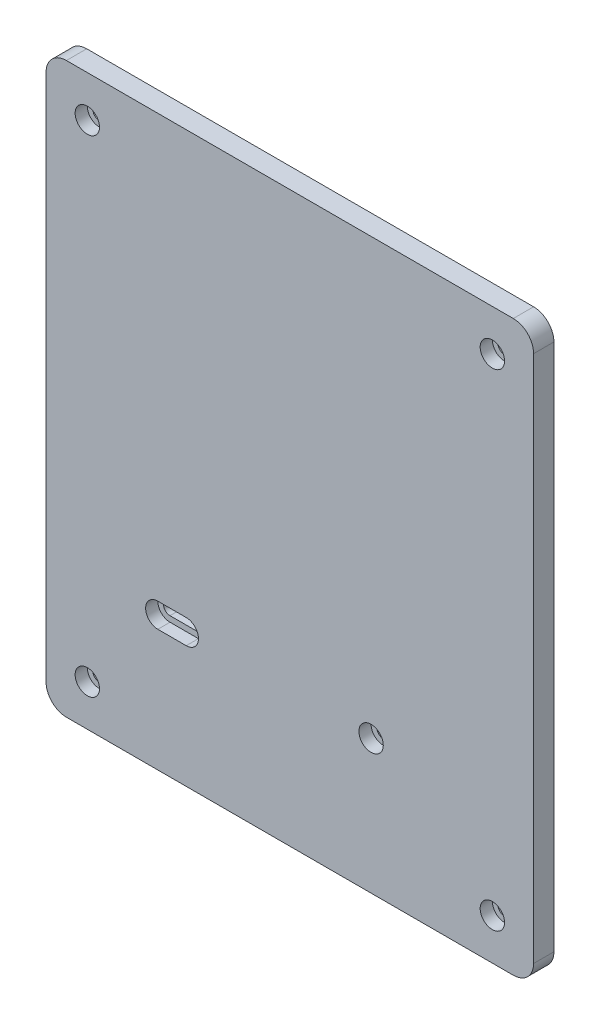
ISO-10303-21;
HEADER;
FILE_DESCRIPTION(('STEP AP214'),'2;1');
FILE_NAME('part.step','',(''),(''),'','','');
FILE_SCHEMA(('AUTOMOTIVE_DESIGN { 1 0 10303 214 1 1 1 1 }'));
ENDSEC;
DATA;
#1=APPLICATION_CONTEXT('core data for automotive mechanical design processes');
#2=APPLICATION_PROTOCOL_DEFINITION('international standard','automotive_design',2000,#1);
#3=PRODUCT_CONTEXT('',#1,'mechanical');
#4=PRODUCT('Part','Part','',(#3));
#5=PRODUCT_RELATED_PRODUCT_CATEGORY('part','',(#4));
#6=PRODUCT_DEFINITION_FORMATION('','',#4);
#7=PRODUCT_DEFINITION_CONTEXT('part definition',#1,'design');
#8=PRODUCT_DEFINITION('design','',#6,#7);
#9=PRODUCT_DEFINITION_SHAPE('','',#8);
#10=(LENGTH_UNIT() NAMED_UNIT(*) SI_UNIT(.MILLI.,.METRE.));
#11=(NAMED_UNIT(*) PLANE_ANGLE_UNIT() SI_UNIT($,.RADIAN.));
#12=(NAMED_UNIT(*) SI_UNIT($,.STERADIAN.) SOLID_ANGLE_UNIT());
#13=UNCERTAINTY_MEASURE_WITH_UNIT(LENGTH_MEASURE(1.E-05),#10,'distance_accuracy_value','');
#14=(GEOMETRIC_REPRESENTATION_CONTEXT(3) GLOBAL_UNCERTAINTY_ASSIGNED_CONTEXT((#13)) GLOBAL_UNIT_ASSIGNED_CONTEXT((#10,
#11,#12)) REPRESENTATION_CONTEXT('',''));
#15=CARTESIAN_POINT('',(0.,0.,0.));
#16=DIRECTION('',(0.,0.,1.));
#17=DIRECTION('',(1.,0.,0.));
#18=AXIS2_PLACEMENT_3D('',#15,#16,#17);
#19=CARTESIAN_POINT('',(-49.85,-59.85,5.));
#20=DIRECTION('',(0.,0.,-1.));
#21=DIRECTION('',(-1.,0.,0.));
#22=AXIS2_PLACEMENT_3D('',#19,#20,#21);
#23=CYLINDRICAL_SURFACE('',#22,1.65);
#24=CARTESIAN_POINT('',(-49.85,-59.85,0.));
#25=DIRECTION('',(0.,0.,1.));
#26=DIRECTION('',(1.,0.,0.));
#27=AXIS2_PLACEMENT_3D('',#24,#25,#26);
#28=CIRCLE('',#27,1.65);
#29=CARTESIAN_POINT('',(-48.2,-59.85,0.));
#30=VERTEX_POINT('',#29);
#31=EDGE_CURVE('E197',#30,#30,#28,.T.);
#32=ORIENTED_EDGE('',*,*,#31,.F.);
#33=EDGE_LOOP('',(#32));
#34=FACE_BOUND('',#33,.T.);
#35=CARTESIAN_POINT('',(-49.85,-59.85,2.));
#36=DIRECTION('',(0.,0.,1.));
#37=DIRECTION('',(1.,0.,0.));
#38=AXIS2_PLACEMENT_3D('',#35,#36,#37);
#39=CIRCLE('',#38,1.65);
#40=CARTESIAN_POINT('',(-48.2,-59.85,2.));
#41=VERTEX_POINT('',#40);
#42=EDGE_CURVE('E39',#41,#41,#39,.T.);
#43=ORIENTED_EDGE('',*,*,#42,.T.);
#44=EDGE_LOOP('',(#43));
#45=FACE_BOUND('',#44,.T.);
#46=ADVANCED_FACE('F35',(#34,#45),#23,.F.);
#47=CARTESIAN_POINT('',(49.85,-59.85,5.));
#48=DIRECTION('',(0.,0.,-1.));
#49=DIRECTION('',(-1.,0.,0.));
#50=AXIS2_PLACEMENT_3D('',#47,#48,#49);
#51=CYLINDRICAL_SURFACE('',#50,1.65);
#52=CARTESIAN_POINT('',(49.85,-59.85,0.));
#53=DIRECTION('',(0.,0.,1.));
#54=DIRECTION('',(1.,0.,0.));
#55=AXIS2_PLACEMENT_3D('',#52,#53,#54);
#56=CIRCLE('',#55,1.65);
#57=CARTESIAN_POINT('',(51.5,-59.85,0.));
#58=VERTEX_POINT('',#57);
#59=EDGE_CURVE('E194',#58,#58,#56,.T.);
#60=ORIENTED_EDGE('',*,*,#59,.F.);
#61=EDGE_LOOP('',(#60));
#62=FACE_BOUND('',#61,.T.);
#63=CARTESIAN_POINT('',(49.85,-59.85,2.));
#64=DIRECTION('',(0.,0.,1.));
#65=DIRECTION('',(1.,0.,0.));
#66=AXIS2_PLACEMENT_3D('',#63,#64,#65);
#67=CIRCLE('',#66,1.65);
#68=CARTESIAN_POINT('',(51.5,-59.85,2.));
#69=VERTEX_POINT('',#68);
#70=EDGE_CURVE('E262',#69,#69,#67,.T.);
#71=ORIENTED_EDGE('',*,*,#70,.T.);
#72=EDGE_LOOP('',(#71));
#73=FACE_BOUND('',#72,.T.);
#74=ADVANCED_FACE('F423',(#62,#73),#51,.F.);
#75=CARTESIAN_POINT('',(49.85,59.85,5.));
#76=DIRECTION('',(0.,0.,-1.));
#77=DIRECTION('',(-1.,0.,0.));
#78=AXIS2_PLACEMENT_3D('',#75,#76,#77);
#79=CYLINDRICAL_SURFACE('',#78,1.65);
#80=CARTESIAN_POINT('',(49.85,59.85,0.));
#81=DIRECTION('',(0.,0.,1.));
#82=DIRECTION('',(1.,0.,0.));
#83=AXIS2_PLACEMENT_3D('',#80,#81,#82);
#84=CIRCLE('',#83,1.65);
#85=CARTESIAN_POINT('',(51.5,59.85,0.));
#86=VERTEX_POINT('',#85);
#87=EDGE_CURVE('E191',#86,#86,#84,.T.);
#88=ORIENTED_EDGE('',*,*,#87,.F.);
#89=EDGE_LOOP('',(#88));
#90=FACE_BOUND('',#89,.T.);
#91=CARTESIAN_POINT('',(49.85,59.85,2.));
#92=DIRECTION('',(0.,0.,1.));
#93=DIRECTION('',(1.,0.,0.));
#94=AXIS2_PLACEMENT_3D('',#91,#92,#93);
#95=CIRCLE('',#94,1.65);
#96=CARTESIAN_POINT('',(51.5,59.85,2.));
#97=VERTEX_POINT('',#96);
#98=EDGE_CURVE('E259',#97,#97,#95,.T.);
#99=ORIENTED_EDGE('',*,*,#98,.T.);
#100=EDGE_LOOP('',(#99));
#101=FACE_BOUND('',#100,.T.);
#102=ADVANCED_FACE('F429',(#90,#101),#79,.F.);
#103=CARTESIAN_POINT('',(-49.85,59.85,5.));
#104=DIRECTION('',(0.,0.,-1.));
#105=DIRECTION('',(-1.,0.,0.));
#106=AXIS2_PLACEMENT_3D('',#103,#104,#105);
#107=CYLINDRICAL_SURFACE('',#106,1.65);
#108=CARTESIAN_POINT('',(-49.85,59.85,0.));
#109=DIRECTION('',(0.,0.,1.));
#110=DIRECTION('',(1.,0.,0.));
#111=AXIS2_PLACEMENT_3D('',#108,#109,#110);
#112=CIRCLE('',#111,1.65);
#113=CARTESIAN_POINT('',(-48.2,59.85,0.));
#114=VERTEX_POINT('',#113);
#115=EDGE_CURVE('E188',#114,#114,#112,.T.);
#116=ORIENTED_EDGE('',*,*,#115,.F.);
#117=EDGE_LOOP('',(#116));
#118=FACE_BOUND('',#117,.T.);
#119=CARTESIAN_POINT('',(-49.85,59.85,2.));
#120=DIRECTION('',(0.,0.,1.));
#121=DIRECTION('',(1.,0.,0.));
#122=AXIS2_PLACEMENT_3D('',#119,#120,#121);
#123=CIRCLE('',#122,1.65);
#124=CARTESIAN_POINT('',(-48.2,59.85,2.));
#125=VERTEX_POINT('',#124);
#126=EDGE_CURVE('E256',#125,#125,#123,.T.);
#127=ORIENTED_EDGE('',*,*,#126,.T.);
#128=EDGE_LOOP('',(#127));
#129=FACE_BOUND('',#128,.T.);
#130=ADVANCED_FACE('F488',(#118,#129),#107,.F.);
#131=CARTESIAN_POINT('',(0.,-38.6,-10.6901824119142));
#132=DIRECTION('',(0.,-1.,0.));
#133=DIRECTION('',(0.,0.,-1.));
#134=AXIS2_PLACEMENT_3D('',#131,#132,#133);
#135=PLANE('',#134);
#136=DIRECTION('',(1.,0.,0.));
#137=VECTOR('',#136,1.);
#138=CARTESIAN_POINT('',(-32.5,-38.6,2.));
#139=LINE('',#138,#137);
#140=CARTESIAN_POINT('',(-32.5,-38.6,2.));
#141=VERTEX_POINT('',#140);
#142=CARTESIAN_POINT('',(-25.5,-38.6,2.));
#143=VERTEX_POINT('',#142);
#144=EDGE_CURVE('E148',#141,#143,#139,.T.);
#145=ORIENTED_EDGE('',*,*,#144,.T.);
#146=DIRECTION('',(0.,0.,1.));
#147=VECTOR('',#146,1.);
#148=CARTESIAN_POINT('',(-25.5,-38.6,-10.6901824119142));
#149=LINE('',#148,#147);
#150=CARTESIAN_POINT('',(-25.5,-38.6,0.));
#151=VERTEX_POINT('',#150);
#152=EDGE_CURVE('E183',#151,#143,#149,.T.);
#153=ORIENTED_EDGE('',*,*,#152,.F.);
#154=DIRECTION('',(-1.,0.,0.));
#155=VECTOR('',#154,1.);
#156=CARTESIAN_POINT('',(0.,-38.6,0.));
#157=LINE('',#156,#155);
#158=CARTESIAN_POINT('',(-32.5,-38.6,0.));
#159=VERTEX_POINT('',#158);
#160=EDGE_CURVE('E170',#151,#159,#157,.T.);
#161=ORIENTED_EDGE('',*,*,#160,.T.);
#162=DIRECTION('',(0.,0.,1.));
#163=VECTOR('',#162,1.);
#164=CARTESIAN_POINT('',(-32.5,-38.6,-10.6901824119142));
#165=LINE('',#164,#163);
#166=EDGE_CURVE('E163',#159,#141,#165,.T.);
#167=ORIENTED_EDGE('',*,*,#166,.T.);
#168=EDGE_LOOP('',(#145,#153,#161,#167));
#169=FACE_BOUND('',#168,.T.);
#170=ADVANCED_FACE('F168',(#169),#135,.F.);
#171=CARTESIAN_POINT('',(-32.5,-37.,-10.6901824119142));
#172=DIRECTION('',(0.,0.,1.));
#173=DIRECTION('',(1.,0.,0.));
#174=AXIS2_PLACEMENT_3D('',#171,#172,#173);
#175=CYLINDRICAL_SURFACE('',#174,1.6);
#176=CARTESIAN_POINT('',(-32.5,-37.,2.));
#177=DIRECTION('',(0.,0.,1.));
#178=DIRECTION('',(1.,0.,0.));
#179=AXIS2_PLACEMENT_3D('',#176,#177,#178);
#180=CIRCLE('',#179,1.6);
#181=CARTESIAN_POINT('',(-32.5,-35.4,2.));
#182=VERTEX_POINT('',#181);
#183=EDGE_CURVE('E152',#182,#141,#180,.T.);
#184=ORIENTED_EDGE('',*,*,#183,.T.);
#185=ORIENTED_EDGE('',*,*,#166,.F.);
#186=CARTESIAN_POINT('',(-32.5,-37.,0.));
#187=DIRECTION('',(0.,0.,1.));
#188=DIRECTION('',(1.,0.,0.));
#189=AXIS2_PLACEMENT_3D('',#186,#187,#188);
#190=CIRCLE('',#189,1.6);
#191=CARTESIAN_POINT('',(-32.5,-35.4,0.));
#192=VERTEX_POINT('',#191);
#193=EDGE_CURVE('E174',#159,#192,#190,.F.);
#194=ORIENTED_EDGE('',*,*,#193,.T.);
#195=DIRECTION('',(0.,0.,1.));
#196=VECTOR('',#195,1.);
#197=CARTESIAN_POINT('',(-32.5,-35.4,-10.6901824119142));
#198=LINE('',#197,#196);
#199=EDGE_CURVE('E166',#192,#182,#198,.T.);
#200=ORIENTED_EDGE('',*,*,#199,.T.);
#201=EDGE_LOOP('',(#184,#185,#194,#200));
#202=FACE_BOUND('',#201,.T.);
#203=ADVANCED_FACE('F162',(#202),#175,.F.);
#204=CARTESIAN_POINT('',(0.,-35.4,-10.6901824119142));
#205=DIRECTION('',(0.,-1.,0.));
#206=DIRECTION('',(0.,0.,-1.));
#207=AXIS2_PLACEMENT_3D('',#204,#205,#206);
#208=PLANE('',#207);
#209=DIRECTION('',(0.,0.,1.));
#210=VECTOR('',#209,1.);
#211=CARTESIAN_POINT('',(-25.5,-35.4,-10.6901824119142));
#212=LINE('',#211,#210);
#213=CARTESIAN_POINT('',(-25.5,-35.4,0.));
#214=VERTEX_POINT('',#213);
#215=CARTESIAN_POINT('',(-25.5,-35.4,2.));
#216=VERTEX_POINT('',#215);
#217=EDGE_CURVE('E176',#214,#216,#212,.T.);
#218=ORIENTED_EDGE('',*,*,#217,.T.);
#219=DIRECTION('',(-1.,0.,0.));
#220=VECTOR('',#219,1.);
#221=CARTESIAN_POINT('',(-32.5,-35.4,2.));
#222=LINE('',#221,#220);
#223=EDGE_CURVE('E60',#216,#182,#222,.T.);
#224=ORIENTED_EDGE('',*,*,#223,.T.);
#225=ORIENTED_EDGE('',*,*,#199,.F.);
#226=DIRECTION('',(-1.,0.,0.));
#227=VECTOR('',#226,1.);
#228=CARTESIAN_POINT('',(0.,-35.4,0.));
#229=LINE('',#228,#227);
#230=EDGE_CURVE('E171',#214,#192,#229,.T.);
#231=ORIENTED_EDGE('',*,*,#230,.F.);
#232=EDGE_LOOP('',(#218,#224,#225,#231));
#233=FACE_BOUND('',#232,.T.);
#234=ADVANCED_FACE('F309',(#233),#208,.T.);
#235=CARTESIAN_POINT('',(-25.5,-37.,-10.6901824119142));
#236=DIRECTION('',(0.,0.,1.));
#237=DIRECTION('',(1.,0.,0.));
#238=AXIS2_PLACEMENT_3D('',#235,#236,#237);
#239=CYLINDRICAL_SURFACE('',#238,1.6);
#240=CARTESIAN_POINT('',(-25.5,-37.,2.));
#241=DIRECTION('',(0.,0.,1.));
#242=DIRECTION('',(1.,0.,0.));
#243=AXIS2_PLACEMENT_3D('',#240,#241,#242);
#244=CIRCLE('',#243,1.6);
#245=EDGE_CURVE('E153',#143,#216,#244,.T.);
#246=ORIENTED_EDGE('',*,*,#245,.T.);
#247=ORIENTED_EDGE('',*,*,#217,.F.);
#248=CARTESIAN_POINT('',(-25.5,-37.,0.));
#249=DIRECTION('',(0.,0.,1.));
#250=DIRECTION('',(1.,0.,0.));
#251=AXIS2_PLACEMENT_3D('',#248,#249,#250);
#252=CIRCLE('',#251,1.6);
#253=EDGE_CURVE('E185',#214,#151,#252,.F.);
#254=ORIENTED_EDGE('',*,*,#253,.T.);
#255=ORIENTED_EDGE('',*,*,#152,.T.);
#256=EDGE_LOOP('',(#246,#247,#254,#255));
#257=FACE_BOUND('',#256,.T.);
#258=ADVANCED_FACE('F314',(#257),#239,.F.);
#259=CARTESIAN_POINT('',(20.,-37.,-10.6901824119142));
#260=DIRECTION('',(0.,0.,1.));
#261=DIRECTION('',(1.,0.,0.));
#262=AXIS2_PLACEMENT_3D('',#259,#260,#261);
#263=CYLINDRICAL_SURFACE('',#262,1.6);
#264=CARTESIAN_POINT('',(20.,-37.,0.));
#265=DIRECTION('',(0.,0.,1.));
#266=DIRECTION('',(1.,0.,0.));
#267=AXIS2_PLACEMENT_3D('',#264,#265,#266);
#268=CIRCLE('',#267,1.6);
#269=CARTESIAN_POINT('',(21.6,-37.,0.));
#270=VERTEX_POINT('',#269);
#271=EDGE_CURVE('E187',#270,#270,#268,.F.);
#272=ORIENTED_EDGE('',*,*,#271,.T.);
#273=EDGE_LOOP('',(#272));
#274=FACE_BOUND('',#273,.T.);
#275=CARTESIAN_POINT('',(20.,-37.,2.));
#276=DIRECTION('',(0.,0.,1.));
#277=DIRECTION('',(1.,0.,0.));
#278=AXIS2_PLACEMENT_3D('',#275,#276,#277);
#279=CIRCLE('',#278,1.6);
#280=CARTESIAN_POINT('',(21.6,-37.,2.));
#281=VERTEX_POINT('',#280);
#282=EDGE_CURVE('E290',#281,#281,#279,.T.);
#283=ORIENTED_EDGE('',*,*,#282,.T.);
#284=EDGE_LOOP('',(#283));
#285=FACE_BOUND('',#284,.T.);
#286=ADVANCED_FACE('F366',(#274,#285),#263,.F.);
#287=CARTESIAN_POINT('',(0.,0.,5.));
#288=DIRECTION('',(0.,0.,1.));
#289=DIRECTION('',(1.,0.,0.));
#290=AXIS2_PLACEMENT_3D('',#287,#288,#289);
#291=PLANE('',#290);
#292=CARTESIAN_POINT('',(49.85,59.85,5.));
#293=DIRECTION('',(0.,0.,1.));
#294=DIRECTION('',(1.,0.,0.));
#295=AXIS2_PLACEMENT_3D('',#292,#293,#294);
#296=CIRCLE('',#295,3.00000000000001);
#297=CARTESIAN_POINT('',(52.85,59.85,5.));
#298=VERTEX_POINT('',#297);
#299=EDGE_CURVE('E349',#298,#298,#296,.T.);
#300=ORIENTED_EDGE('',*,*,#299,.F.);
#301=EDGE_LOOP('',(#300));
#302=FACE_BOUND('',#301,.T.);
#303=CARTESIAN_POINT('',(49.85,-59.85,5.));
#304=DIRECTION('',(0.,0.,1.));
#305=DIRECTION('',(1.,0.,0.));
#306=AXIS2_PLACEMENT_3D('',#303,#304,#305);
#307=CIRCLE('',#306,3.00000000000001);
#308=CARTESIAN_POINT('',(52.85,-59.85,5.));
#309=VERTEX_POINT('',#308);
#310=EDGE_CURVE('E279',#309,#309,#307,.T.);
#311=ORIENTED_EDGE('',*,*,#310,.F.);
#312=EDGE_LOOP('',(#311));
#313=FACE_BOUND('',#312,.T.);
#314=CARTESIAN_POINT('',(-49.85,-59.85,5.));
#315=DIRECTION('',(0.,0.,1.));
#316=DIRECTION('',(1.,0.,0.));
#317=AXIS2_PLACEMENT_3D('',#314,#315,#316);
#318=CIRCLE('',#317,2.99999999999999);
#319=CARTESIAN_POINT('',(-46.85,-59.85,5.));
#320=VERTEX_POINT('',#319);
#321=EDGE_CURVE('E280',#320,#320,#318,.T.);
#322=ORIENTED_EDGE('',*,*,#321,.F.);
#323=EDGE_LOOP('',(#322));
#324=FACE_BOUND('',#323,.T.);
#325=CARTESIAN_POINT('',(20.,-37.,5.));
#326=DIRECTION('',(0.,0.,1.));
#327=DIRECTION('',(1.,0.,0.));
#328=AXIS2_PLACEMENT_3D('',#325,#326,#327);
#329=CIRCLE('',#328,3.);
#330=CARTESIAN_POINT('',(23.,-37.,5.));
#331=VERTEX_POINT('',#330);
#332=EDGE_CURVE('E293',#331,#331,#329,.T.);
#333=ORIENTED_EDGE('',*,*,#332,.F.);
#334=EDGE_LOOP('',(#333));
#335=FACE_BOUND('',#334,.T.);
#336=CARTESIAN_POINT('',(-32.5,-37.,5.));
#337=DIRECTION('',(0.,0.,1.));
#338=DIRECTION('',(1.,0.,0.));
#339=AXIS2_PLACEMENT_3D('',#336,#337,#338);
#340=CIRCLE('',#339,3.);
#341=CARTESIAN_POINT('',(-32.5,-34.,5.));
#342=VERTEX_POINT('',#341);
#343=CARTESIAN_POINT('',(-32.5,-40.,5.));
#344=VERTEX_POINT('',#343);
#345=EDGE_CURVE('E52',#342,#344,#340,.T.);
#346=ORIENTED_EDGE('',*,*,#345,.F.);
#347=DIRECTION('',(-1.,0.,0.));
#348=VECTOR('',#347,1.);
#349=CARTESIAN_POINT('',(-32.5,-34.,5.));
#350=LINE('',#349,#348);
#351=CARTESIAN_POINT('',(-25.5,-34.,5.));
#352=VERTEX_POINT('',#351);
#353=EDGE_CURVE('E322',#352,#342,#350,.T.);
#354=ORIENTED_EDGE('',*,*,#353,.F.);
#355=CARTESIAN_POINT('',(-25.5,-37.,5.));
#356=DIRECTION('',(0.,0.,1.));
#357=DIRECTION('',(1.,0.,0.));
#358=AXIS2_PLACEMENT_3D('',#355,#356,#357);
#359=CIRCLE('',#358,3.);
#360=CARTESIAN_POINT('',(-25.5,-40.,5.));
#361=VERTEX_POINT('',#360);
#362=EDGE_CURVE('E336',#361,#352,#359,.T.);
#363=ORIENTED_EDGE('',*,*,#362,.F.);
#364=DIRECTION('',(1.,0.,0.));
#365=VECTOR('',#364,1.);
#366=CARTESIAN_POINT('',(-32.5,-40.,5.));
#367=LINE('',#366,#365);
#368=EDGE_CURVE('E333',#344,#361,#367,.T.);
#369=ORIENTED_EDGE('',*,*,#368,.F.);
#370=EDGE_LOOP('',(#346,#354,#363,#369));
#371=FACE_BOUND('',#370,.T.);
#372=CARTESIAN_POINT('',(-49.85,59.85,5.));
#373=DIRECTION('',(0.,0.,1.));
#374=DIRECTION('',(1.,0.,0.));
#375=AXIS2_PLACEMENT_3D('',#372,#373,#374);
#376=CIRCLE('',#375,3.);
#377=CARTESIAN_POINT('',(-46.85,59.85,5.));
#378=VERTEX_POINT('',#377);
#379=EDGE_CURVE('E301',#378,#378,#376,.T.);
#380=ORIENTED_EDGE('',*,*,#379,.F.);
#381=EDGE_LOOP('',(#380));
#382=FACE_BOUND('',#381,.T.);
#383=DIRECTION('',(-1.,0.,0.));
#384=VECTOR('',#383,1.);
#385=CARTESIAN_POINT('',(-60.,70.,5.));
#386=LINE('',#385,#384);
#387=CARTESIAN_POINT('',(55.,70.,5.));
#388=VERTEX_POINT('',#387);
#389=CARTESIAN_POINT('',(-55.,70.,5.));
#390=VERTEX_POINT('',#389);
#391=EDGE_CURVE('E204',#388,#390,#386,.T.);
#392=ORIENTED_EDGE('',*,*,#391,.T.);
#393=CARTESIAN_POINT('',(-55.,65.,5.));
#394=DIRECTION('',(0.,0.,1.));
#395=DIRECTION('',(1.,0.,0.));
#396=AXIS2_PLACEMENT_3D('',#393,#394,#395);
#397=CIRCLE('',#396,5.);
#398=CARTESIAN_POINT('',(-60.,65.,5.));
#399=VERTEX_POINT('',#398);
#400=EDGE_CURVE('E248',#390,#399,#397,.T.);
#401=ORIENTED_EDGE('',*,*,#400,.T.);
#402=DIRECTION('',(0.,-1.,0.));
#403=VECTOR('',#402,1.);
#404=CARTESIAN_POINT('',(-60.,70.,5.));
#405=LINE('',#404,#403);
#406=CARTESIAN_POINT('',(-60.,-65.,5.));
#407=VERTEX_POINT('',#406);
#408=EDGE_CURVE('E208',#399,#407,#405,.T.);
#409=ORIENTED_EDGE('',*,*,#408,.T.);
#410=CARTESIAN_POINT('',(-55.,-65.,5.));
#411=DIRECTION('',(0.,0.,1.));
#412=DIRECTION('',(1.,0.,0.));
#413=AXIS2_PLACEMENT_3D('',#410,#411,#412);
#414=CIRCLE('',#413,5.);
#415=CARTESIAN_POINT('',(-55.,-70.,5.));
#416=VERTEX_POINT('',#415);
#417=EDGE_CURVE('E246',#407,#416,#414,.T.);
#418=ORIENTED_EDGE('',*,*,#417,.T.);
#419=DIRECTION('',(1.,0.,0.));
#420=VECTOR('',#419,1.);
#421=CARTESIAN_POINT('',(-60.,-70.,5.));
#422=LINE('',#421,#420);
#423=CARTESIAN_POINT('',(55.,-70.,5.));
#424=VERTEX_POINT('',#423);
#425=EDGE_CURVE('E211',#416,#424,#422,.T.);
#426=ORIENTED_EDGE('',*,*,#425,.T.);
#427=CARTESIAN_POINT('',(55.,-65.,5.));
#428=DIRECTION('',(0.,0.,1.));
#429=DIRECTION('',(1.,0.,0.));
#430=AXIS2_PLACEMENT_3D('',#427,#428,#429);
#431=CIRCLE('',#430,5.);
#432=CARTESIAN_POINT('',(60.,-65.,5.));
#433=VERTEX_POINT('',#432);
#434=EDGE_CURVE('E244',#424,#433,#431,.T.);
#435=ORIENTED_EDGE('',*,*,#434,.T.);
#436=DIRECTION('',(0.,1.,0.));
#437=VECTOR('',#436,1.);
#438=CARTESIAN_POINT('',(60.,70.,5.));
#439=LINE('',#438,#437);
#440=CARTESIAN_POINT('',(60.,65.,5.));
#441=VERTEX_POINT('',#440);
#442=EDGE_CURVE('E201',#433,#441,#439,.T.);
#443=ORIENTED_EDGE('',*,*,#442,.T.);
#444=CARTESIAN_POINT('',(55.,65.,5.));
#445=DIRECTION('',(0.,0.,1.));
#446=DIRECTION('',(1.,0.,0.));
#447=AXIS2_PLACEMENT_3D('',#444,#445,#446);
#448=CIRCLE('',#447,5.);
#449=EDGE_CURVE('E242',#441,#388,#448,.T.);
#450=ORIENTED_EDGE('',*,*,#449,.T.);
#451=EDGE_LOOP('',(#392,#401,#409,#418,#426,#435,#443,#450));
#452=FACE_BOUND('',#451,.T.);
#453=ADVANCED_FACE('F363',(#302,#313,#324,#335,#371,#382,#452),#291,.T.);
#454=CARTESIAN_POINT('',(0.,0.,0.));
#455=DIRECTION('',(0.,0.,1.));
#456=DIRECTION('',(1.,0.,0.));
#457=AXIS2_PLACEMENT_3D('',#454,#455,#456);
#458=PLANE('',#457);
#459=ORIENTED_EDGE('',*,*,#271,.F.);
#460=EDGE_LOOP('',(#459));
#461=FACE_BOUND('',#460,.T.);
#462=ORIENTED_EDGE('',*,*,#193,.F.);
#463=ORIENTED_EDGE('',*,*,#160,.F.);
#464=ORIENTED_EDGE('',*,*,#253,.F.);
#465=ORIENTED_EDGE('',*,*,#230,.T.);
#466=EDGE_LOOP('',(#462,#463,#464,#465));
#467=FACE_BOUND('',#466,.T.);
#468=DIRECTION('',(0.,-1.,0.));
#469=VECTOR('',#468,1.);
#470=CARTESIAN_POINT('',(-60.,70.,0.));
#471=LINE('',#470,#469);
#472=CARTESIAN_POINT('',(-60.,65.,0.));
#473=VERTEX_POINT('',#472);
#474=CARTESIAN_POINT('',(-60.,-65.,0.));
#475=VERTEX_POINT('',#474);
#476=EDGE_CURVE('E220',#473,#475,#471,.T.);
#477=ORIENTED_EDGE('',*,*,#476,.F.);
#478=CARTESIAN_POINT('',(-55.,65.,0.));
#479=DIRECTION('',(0.,0.,1.));
#480=DIRECTION('',(1.,0.,0.));
#481=AXIS2_PLACEMENT_3D('',#478,#479,#480);
#482=CIRCLE('',#481,5.);
#483=CARTESIAN_POINT('',(-55.,70.,0.));
#484=VERTEX_POINT('',#483);
#485=EDGE_CURVE('E235',#473,#484,#482,.F.);
#486=ORIENTED_EDGE('',*,*,#485,.T.);
#487=DIRECTION('',(-1.,0.,0.));
#488=VECTOR('',#487,1.);
#489=CARTESIAN_POINT('',(-60.,70.,0.));
#490=LINE('',#489,#488);
#491=CARTESIAN_POINT('',(55.,70.,0.));
#492=VERTEX_POINT('',#491);
#493=EDGE_CURVE('E217',#492,#484,#490,.T.);
#494=ORIENTED_EDGE('',*,*,#493,.F.);
#495=CARTESIAN_POINT('',(55.,65.,0.));
#496=DIRECTION('',(0.,0.,1.));
#497=DIRECTION('',(1.,0.,0.));
#498=AXIS2_PLACEMENT_3D('',#495,#496,#497);
#499=CIRCLE('',#498,5.);
#500=CARTESIAN_POINT('',(60.,65.,0.));
#501=VERTEX_POINT('',#500);
#502=EDGE_CURVE('E229',#492,#501,#499,.F.);
#503=ORIENTED_EDGE('',*,*,#502,.T.);
#504=DIRECTION('',(0.,1.,0.));
#505=VECTOR('',#504,1.);
#506=CARTESIAN_POINT('',(60.,70.,0.));
#507=LINE('',#506,#505);
#508=CARTESIAN_POINT('',(60.,-65.,0.));
#509=VERTEX_POINT('',#508);
#510=EDGE_CURVE('E200',#509,#501,#507,.T.);
#511=ORIENTED_EDGE('',*,*,#510,.F.);
#512=CARTESIAN_POINT('',(55.,-65.,0.));
#513=DIRECTION('',(0.,0.,1.));
#514=DIRECTION('',(1.,0.,0.));
#515=AXIS2_PLACEMENT_3D('',#512,#513,#514);
#516=CIRCLE('',#515,5.);
#517=CARTESIAN_POINT('',(55.,-70.,0.));
#518=VERTEX_POINT('',#517);
#519=EDGE_CURVE('E231',#509,#518,#516,.F.);
#520=ORIENTED_EDGE('',*,*,#519,.T.);
#521=DIRECTION('',(1.,0.,0.));
#522=VECTOR('',#521,1.);
#523=CARTESIAN_POINT('',(-60.,-70.,0.));
#524=LINE('',#523,#522);
#525=CARTESIAN_POINT('',(-55.,-70.,0.));
#526=VERTEX_POINT('',#525);
#527=EDGE_CURVE('E205',#526,#518,#524,.T.);
#528=ORIENTED_EDGE('',*,*,#527,.F.);
#529=CARTESIAN_POINT('',(-55.,-65.,0.));
#530=DIRECTION('',(0.,0.,1.));
#531=DIRECTION('',(1.,0.,0.));
#532=AXIS2_PLACEMENT_3D('',#529,#530,#531);
#533=CIRCLE('',#532,5.);
#534=EDGE_CURVE('E233',#526,#475,#533,.F.);
#535=ORIENTED_EDGE('',*,*,#534,.T.);
#536=EDGE_LOOP('',(#477,#486,#494,#503,#511,#520,#528,#535));
#537=FACE_BOUND('',#536,.T.);
#538=ORIENTED_EDGE('',*,*,#31,.T.);
#539=EDGE_LOOP('',(#538));
#540=FACE_BOUND('',#539,.T.);
#541=ORIENTED_EDGE('',*,*,#59,.T.);
#542=EDGE_LOOP('',(#541));
#543=FACE_BOUND('',#542,.T.);
#544=ORIENTED_EDGE('',*,*,#87,.T.);
#545=EDGE_LOOP('',(#544));
#546=FACE_BOUND('',#545,.T.);
#547=ORIENTED_EDGE('',*,*,#115,.T.);
#548=EDGE_LOOP('',(#547));
#549=FACE_BOUND('',#548,.T.);
#550=ADVANCED_FACE('F311',(#461,#467,#537,#540,#543,#546,#549),#458,.F.);
#551=CARTESIAN_POINT('',(60.,70.,5.));
#552=DIRECTION('',(-1.,0.,0.));
#553=DIRECTION('',(0.,0.,1.));
#554=AXIS2_PLACEMENT_3D('',#551,#552,#553);
#555=PLANE('',#554);
#556=ORIENTED_EDGE('',*,*,#442,.F.);
#557=DIRECTION('',(0.,0.,-1.));
#558=VECTOR('',#557,1.);
#559=CARTESIAN_POINT('',(60.,-65.,5.));
#560=LINE('',#559,#558);
#561=EDGE_CURVE('E11',#433,#509,#560,.T.);
#562=ORIENTED_EDGE('',*,*,#561,.T.);
#563=ORIENTED_EDGE('',*,*,#510,.T.);
#564=DIRECTION('',(0.,0.,-1.));
#565=VECTOR('',#564,1.);
#566=CARTESIAN_POINT('',(60.,65.,5.));
#567=LINE('',#566,#565);
#568=EDGE_CURVE('E44',#501,#441,#567,.F.);
#569=ORIENTED_EDGE('',*,*,#568,.T.);
#570=EDGE_LOOP('',(#556,#562,#563,#569));
#571=FACE_BOUND('',#570,.T.);
#572=ADVANCED_FACE('F410',(#571),#555,.F.);
#573=CARTESIAN_POINT('',(-60.,70.,5.));
#574=DIRECTION('',(0.,-1.,0.));
#575=DIRECTION('',(0.,0.,-1.));
#576=AXIS2_PLACEMENT_3D('',#573,#574,#575);
#577=PLANE('',#576);
#578=ORIENTED_EDGE('',*,*,#493,.T.);
#579=DIRECTION('',(0.,0.,-1.));
#580=VECTOR('',#579,1.);
#581=CARTESIAN_POINT('',(-55.,70.,5.));
#582=LINE('',#581,#580);
#583=EDGE_CURVE('E240',#484,#390,#582,.F.);
#584=ORIENTED_EDGE('',*,*,#583,.T.);
#585=ORIENTED_EDGE('',*,*,#391,.F.);
#586=DIRECTION('',(0.,0.,-1.));
#587=VECTOR('',#586,1.);
#588=CARTESIAN_POINT('',(55.,70.,5.));
#589=LINE('',#588,#587);
#590=EDGE_CURVE('E237',#388,#492,#589,.T.);
#591=ORIENTED_EDGE('',*,*,#590,.T.);
#592=EDGE_LOOP('',(#578,#584,#585,#591));
#593=FACE_BOUND('',#592,.T.);
#594=ADVANCED_FACE('F413',(#593),#577,.F.);
#595=CARTESIAN_POINT('',(-60.,70.,5.));
#596=DIRECTION('',(1.,0.,0.));
#597=DIRECTION('',(0.,0.,-1.));
#598=AXIS2_PLACEMENT_3D('',#595,#596,#597);
#599=PLANE('',#598);
#600=ORIENTED_EDGE('',*,*,#408,.F.);
#601=DIRECTION('',(0.,0.,-1.));
#602=VECTOR('',#601,1.);
#603=CARTESIAN_POINT('',(-60.,65.,5.));
#604=LINE('',#603,#602);
#605=EDGE_CURVE('E226',#399,#473,#604,.T.);
#606=ORIENTED_EDGE('',*,*,#605,.T.);
#607=ORIENTED_EDGE('',*,*,#476,.T.);
#608=DIRECTION('',(0.,0.,-1.));
#609=VECTOR('',#608,1.);
#610=CARTESIAN_POINT('',(-60.,-65.,5.));
#611=LINE('',#610,#609);
#612=EDGE_CURVE('E214',#475,#407,#611,.F.);
#613=ORIENTED_EDGE('',*,*,#612,.T.);
#614=EDGE_LOOP('',(#600,#606,#607,#613));
#615=FACE_BOUND('',#614,.T.);
#616=ADVANCED_FACE('F390',(#615),#599,.F.);
#617=CARTESIAN_POINT('',(-60.,-70.,5.));
#618=DIRECTION('',(0.,1.,0.));
#619=DIRECTION('',(0.,0.,1.));
#620=AXIS2_PLACEMENT_3D('',#617,#618,#619);
#621=PLANE('',#620);
#622=ORIENTED_EDGE('',*,*,#425,.F.);
#623=DIRECTION('',(0.,0.,-1.));
#624=VECTOR('',#623,1.);
#625=CARTESIAN_POINT('',(-55.,-70.,5.));
#626=LINE('',#625,#624);
#627=EDGE_CURVE('E252',#416,#526,#626,.T.);
#628=ORIENTED_EDGE('',*,*,#627,.T.);
#629=ORIENTED_EDGE('',*,*,#527,.T.);
#630=DIRECTION('',(0.,0.,-1.));
#631=VECTOR('',#630,1.);
#632=CARTESIAN_POINT('',(55.,-70.,5.));
#633=LINE('',#632,#631);
#634=EDGE_CURVE('E250',#518,#424,#633,.F.);
#635=ORIENTED_EDGE('',*,*,#634,.T.);
#636=EDGE_LOOP('',(#622,#628,#629,#635));
#637=FACE_BOUND('',#636,.T.);
#638=ADVANCED_FACE('F401',(#637),#621,.F.);
#639=CARTESIAN_POINT('',(-55.,65.,5.));
#640=DIRECTION('',(0.,0.,-1.));
#641=DIRECTION('',(-1.,0.,0.));
#642=AXIS2_PLACEMENT_3D('',#639,#640,#641);
#643=CYLINDRICAL_SURFACE('',#642,5.);
#644=ORIENTED_EDGE('',*,*,#400,.F.);
#645=ORIENTED_EDGE('',*,*,#583,.F.);
#646=ORIENTED_EDGE('',*,*,#485,.F.);
#647=ORIENTED_EDGE('',*,*,#605,.F.);
#648=EDGE_LOOP('',(#644,#645,#646,#647));
#649=FACE_BOUND('',#648,.T.);
#650=ADVANCED_FACE('F387',(#649),#643,.T.);
#651=CARTESIAN_POINT('',(-55.,-65.,5.));
#652=DIRECTION('',(0.,0.,-1.));
#653=DIRECTION('',(-1.,0.,0.));
#654=AXIS2_PLACEMENT_3D('',#651,#652,#653);
#655=CYLINDRICAL_SURFACE('',#654,5.);
#656=ORIENTED_EDGE('',*,*,#417,.F.);
#657=ORIENTED_EDGE('',*,*,#612,.F.);
#658=ORIENTED_EDGE('',*,*,#534,.F.);
#659=ORIENTED_EDGE('',*,*,#627,.F.);
#660=EDGE_LOOP('',(#656,#657,#658,#659));
#661=FACE_BOUND('',#660,.T.);
#662=ADVANCED_FACE('F398',(#661),#655,.T.);
#663=CARTESIAN_POINT('',(55.,-65.,5.));
#664=DIRECTION('',(0.,0.,-1.));
#665=DIRECTION('',(-1.,0.,0.));
#666=AXIS2_PLACEMENT_3D('',#663,#664,#665);
#667=CYLINDRICAL_SURFACE('',#666,5.);
#668=ORIENTED_EDGE('',*,*,#434,.F.);
#669=ORIENTED_EDGE('',*,*,#634,.F.);
#670=ORIENTED_EDGE('',*,*,#519,.F.);
#671=ORIENTED_EDGE('',*,*,#561,.F.);
#672=EDGE_LOOP('',(#668,#669,#670,#671));
#673=FACE_BOUND('',#672,.T.);
#674=ADVANCED_FACE('F407',(#673),#667,.T.);
#675=CARTESIAN_POINT('',(55.,65.,5.));
#676=DIRECTION('',(0.,0.,-1.));
#677=DIRECTION('',(-1.,0.,0.));
#678=AXIS2_PLACEMENT_3D('',#675,#676,#677);
#679=CYLINDRICAL_SURFACE('',#678,5.);
#680=ORIENTED_EDGE('',*,*,#449,.F.);
#681=ORIENTED_EDGE('',*,*,#568,.F.);
#682=ORIENTED_EDGE('',*,*,#502,.F.);
#683=ORIENTED_EDGE('',*,*,#590,.F.);
#684=EDGE_LOOP('',(#680,#681,#682,#683));
#685=FACE_BOUND('',#684,.T.);
#686=ADVANCED_FACE('F37',(#685),#679,.T.);
#687=CARTESIAN_POINT('',(20.,-37.,2.));
#688=DIRECTION('',(0.,0.,1.));
#689=DIRECTION('',(1.,0.,0.));
#690=AXIS2_PLACEMENT_3D('',#687,#688,#689);
#691=CYLINDRICAL_SURFACE('',#690,3.);
#692=CARTESIAN_POINT('',(20.,-37.,2.));
#693=DIRECTION('',(0.,0.,1.));
#694=DIRECTION('',(1.,0.,0.));
#695=AXIS2_PLACEMENT_3D('',#692,#693,#694);
#696=CIRCLE('',#695,3.);
#697=CARTESIAN_POINT('',(23.,-37.,2.));
#698=VERTEX_POINT('',#697);
#699=EDGE_CURVE('E286',#698,#698,#696,.T.);
#700=ORIENTED_EDGE('',*,*,#699,.F.);
#701=EDGE_LOOP('',(#700));
#702=FACE_BOUND('',#701,.T.);
#703=ORIENTED_EDGE('',*,*,#332,.T.);
#704=EDGE_LOOP('',(#703));
#705=FACE_BOUND('',#704,.T.);
#706=ADVANCED_FACE('F451',(#702,#705),#691,.F.);
#707=CARTESIAN_POINT('',(20.,-37.,2.));
#708=DIRECTION('',(0.,0.,1.));
#709=DIRECTION('',(1.,0.,0.));
#710=AXIS2_PLACEMENT_3D('',#707,#708,#709);
#711=PLANE('',#710);
#712=ORIENTED_EDGE('',*,*,#282,.F.);
#713=EDGE_LOOP('',(#712));
#714=FACE_BOUND('',#713,.T.);
#715=ORIENTED_EDGE('',*,*,#699,.T.);
#716=EDGE_LOOP('',(#715));
#717=FACE_BOUND('',#716,.T.);
#718=ADVANCED_FACE('F455',(#714,#717),#711,.T.);
#719=CARTESIAN_POINT('',(-32.5,-37.,2.));
#720=DIRECTION('',(0.,0.,1.));
#721=DIRECTION('',(1.,0.,0.));
#722=AXIS2_PLACEMENT_3D('',#719,#720,#721);
#723=CYLINDRICAL_SURFACE('',#722,3.);
#724=ORIENTED_EDGE('',*,*,#345,.T.);
#725=DIRECTION('',(0.,0.,1.));
#726=VECTOR('',#725,1.);
#727=CARTESIAN_POINT('',(-32.5,-40.,2.));
#728=LINE('',#727,#726);
#729=CARTESIAN_POINT('',(-32.5,-40.,2.));
#730=VERTEX_POINT('',#729);
#731=EDGE_CURVE('E331',#730,#344,#728,.T.);
#732=ORIENTED_EDGE('',*,*,#731,.F.);
#733=CARTESIAN_POINT('',(-32.5,-37.,2.));
#734=DIRECTION('',(0.,0.,1.));
#735=DIRECTION('',(1.,0.,0.));
#736=AXIS2_PLACEMENT_3D('',#733,#734,#735);
#737=CIRCLE('',#736,3.);
#738=CARTESIAN_POINT('',(-32.5,-34.,2.));
#739=VERTEX_POINT('',#738);
#740=EDGE_CURVE('E318',#739,#730,#737,.T.);
#741=ORIENTED_EDGE('',*,*,#740,.F.);
#742=DIRECTION('',(0.,0.,1.));
#743=VECTOR('',#742,1.);
#744=CARTESIAN_POINT('',(-32.5,-34.,2.));
#745=LINE('',#744,#743);
#746=EDGE_CURVE('E294',#739,#342,#745,.T.);
#747=ORIENTED_EDGE('',*,*,#746,.T.);
#748=EDGE_LOOP('',(#724,#732,#741,#747));
#749=FACE_BOUND('',#748,.T.);
#750=ADVANCED_FACE('F461',(#749),#723,.F.);
#751=CARTESIAN_POINT('',(-32.5,-34.,2.));
#752=DIRECTION('',(0.,1.,0.));
#753=DIRECTION('',(0.,0.,1.));
#754=AXIS2_PLACEMENT_3D('',#751,#752,#753);
#755=PLANE('',#754);
#756=ORIENTED_EDGE('',*,*,#353,.T.);
#757=ORIENTED_EDGE('',*,*,#746,.F.);
#758=DIRECTION('',(-1.,0.,0.));
#759=VECTOR('',#758,1.);
#760=CARTESIAN_POINT('',(-32.5,-34.,2.));
#761=LINE('',#760,#759);
#762=CARTESIAN_POINT('',(-25.5,-34.,2.));
#763=VERTEX_POINT('',#762);
#764=EDGE_CURVE('E328',#763,#739,#761,.T.);
#765=ORIENTED_EDGE('',*,*,#764,.F.);
#766=DIRECTION('',(0.,0.,1.));
#767=VECTOR('',#766,1.);
#768=CARTESIAN_POINT('',(-25.5,-34.,2.));
#769=LINE('',#768,#767);
#770=EDGE_CURVE('E342',#763,#352,#769,.T.);
#771=ORIENTED_EDGE('',*,*,#770,.T.);
#772=EDGE_LOOP('',(#756,#757,#765,#771));
#773=FACE_BOUND('',#772,.T.);
#774=ADVANCED_FACE('F581',(#773),#755,.F.);
#775=CARTESIAN_POINT('',(-25.5,-37.,2.));
#776=DIRECTION('',(0.,0.,1.));
#777=DIRECTION('',(1.,0.,0.));
#778=AXIS2_PLACEMENT_3D('',#775,#776,#777);
#779=CYLINDRICAL_SURFACE('',#778,3.);
#780=ORIENTED_EDGE('',*,*,#362,.T.);
#781=ORIENTED_EDGE('',*,*,#770,.F.);
#782=CARTESIAN_POINT('',(-25.5,-37.,2.));
#783=DIRECTION('',(0.,0.,1.));
#784=DIRECTION('',(1.,0.,0.));
#785=AXIS2_PLACEMENT_3D('',#782,#783,#784);
#786=CIRCLE('',#785,3.);
#787=CARTESIAN_POINT('',(-25.5,-40.,2.));
#788=VERTEX_POINT('',#787);
#789=EDGE_CURVE('E325',#788,#763,#786,.T.);
#790=ORIENTED_EDGE('',*,*,#789,.F.);
#791=DIRECTION('',(0.,0.,1.));
#792=VECTOR('',#791,1.);
#793=CARTESIAN_POINT('',(-25.5,-40.,2.));
#794=LINE('',#793,#792);
#795=EDGE_CURVE('E344',#788,#361,#794,.T.);
#796=ORIENTED_EDGE('',*,*,#795,.T.);
#797=EDGE_LOOP('',(#780,#781,#790,#796));
#798=FACE_BOUND('',#797,.T.);
#799=ADVANCED_FACE('F572',(#798),#779,.F.);
#800=CARTESIAN_POINT('',(-32.5,-40.,2.));
#801=DIRECTION('',(0.,-1.,0.));
#802=DIRECTION('',(0.,0.,-1.));
#803=AXIS2_PLACEMENT_3D('',#800,#801,#802);
#804=PLANE('',#803);
#805=ORIENTED_EDGE('',*,*,#368,.T.);
#806=ORIENTED_EDGE('',*,*,#795,.F.);
#807=DIRECTION('',(1.,0.,0.));
#808=VECTOR('',#807,1.);
#809=CARTESIAN_POINT('',(-32.5,-40.,2.));
#810=LINE('',#809,#808);
#811=EDGE_CURVE('E321',#730,#788,#810,.T.);
#812=ORIENTED_EDGE('',*,*,#811,.F.);
#813=ORIENTED_EDGE('',*,*,#731,.T.);
#814=EDGE_LOOP('',(#805,#806,#812,#813));
#815=FACE_BOUND('',#814,.T.);
#816=ADVANCED_FACE('F564',(#815),#804,.F.);
#817=CARTESIAN_POINT('',(-32.5,-37.,2.));
#818=DIRECTION('',(0.,0.,1.));
#819=DIRECTION('',(1.,0.,0.));
#820=AXIS2_PLACEMENT_3D('',#817,#818,#819);
#821=PLANE('',#820);
#822=ORIENTED_EDGE('',*,*,#223,.F.);
#823=ORIENTED_EDGE('',*,*,#245,.F.);
#824=ORIENTED_EDGE('',*,*,#144,.F.);
#825=ORIENTED_EDGE('',*,*,#183,.F.);
#826=EDGE_LOOP('',(#822,#823,#824,#825));
#827=FACE_BOUND('',#826,.T.);
#828=ORIENTED_EDGE('',*,*,#740,.T.);
#829=ORIENTED_EDGE('',*,*,#811,.T.);
#830=ORIENTED_EDGE('',*,*,#789,.T.);
#831=ORIENTED_EDGE('',*,*,#764,.T.);
#832=EDGE_LOOP('',(#828,#829,#830,#831));
#833=FACE_BOUND('',#832,.T.);
#834=ADVANCED_FACE('F150',(#827,#833),#821,.T.);
#835=CARTESIAN_POINT('',(-49.85,59.85,2.));
#836=DIRECTION('',(0.,0.,1.));
#837=DIRECTION('',(1.,0.,0.));
#838=AXIS2_PLACEMENT_3D('',#835,#836,#837);
#839=CYLINDRICAL_SURFACE('',#838,3.);
#840=CARTESIAN_POINT('',(-49.85,59.85,2.));
#841=DIRECTION('',(0.,0.,1.));
#842=DIRECTION('',(1.,0.,0.));
#843=AXIS2_PLACEMENT_3D('',#840,#841,#842);
#844=CIRCLE('',#843,3.);
#845=CARTESIAN_POINT('',(-46.85,59.85,2.));
#846=VERTEX_POINT('',#845);
#847=EDGE_CURVE('E260',#846,#846,#844,.T.);
#848=ORIENTED_EDGE('',*,*,#847,.F.);
#849=EDGE_LOOP('',(#848));
#850=FACE_BOUND('',#849,.T.);
#851=ORIENTED_EDGE('',*,*,#379,.T.);
#852=EDGE_LOOP('',(#851));
#853=FACE_BOUND('',#852,.T.);
#854=ADVANCED_FACE('F472',(#850,#853),#839,.F.);
#855=CARTESIAN_POINT('',(-49.85,59.85,2.));
#856=DIRECTION('',(0.,0.,1.));
#857=DIRECTION('',(1.,0.,0.));
#858=AXIS2_PLACEMENT_3D('',#855,#856,#857);
#859=PLANE('',#858);
#860=ORIENTED_EDGE('',*,*,#126,.F.);
#861=EDGE_LOOP('',(#860));
#862=FACE_BOUND('',#861,.T.);
#863=ORIENTED_EDGE('',*,*,#847,.T.);
#864=EDGE_LOOP('',(#863));
#865=FACE_BOUND('',#864,.T.);
#866=ADVANCED_FACE('F468',(#862,#865),#859,.T.);
#867=CARTESIAN_POINT('',(49.85,59.85,2.));
#868=DIRECTION('',(0.,0.,1.));
#869=DIRECTION('',(1.,0.,0.));
#870=AXIS2_PLACEMENT_3D('',#867,#868,#869);
#871=CYLINDRICAL_SURFACE('',#870,3.00000000000001);
#872=CARTESIAN_POINT('',(49.85,59.85,2.));
#873=DIRECTION('',(0.,0.,1.));
#874=DIRECTION('',(1.,0.,0.));
#875=AXIS2_PLACEMENT_3D('',#872,#873,#874);
#876=CIRCLE('',#875,3.00000000000001);
#877=CARTESIAN_POINT('',(52.85,59.85,2.));
#878=VERTEX_POINT('',#877);
#879=EDGE_CURVE('E304',#878,#878,#876,.T.);
#880=ORIENTED_EDGE('',*,*,#879,.F.);
#881=EDGE_LOOP('',(#880));
#882=FACE_BOUND('',#881,.T.);
#883=ORIENTED_EDGE('',*,*,#299,.T.);
#884=EDGE_LOOP('',(#883));
#885=FACE_BOUND('',#884,.T.);
#886=ADVANCED_FACE('F471',(#882,#885),#871,.F.);
#887=CARTESIAN_POINT('',(49.85,59.85,2.));
#888=DIRECTION('',(0.,0.,1.));
#889=DIRECTION('',(1.,0.,0.));
#890=AXIS2_PLACEMENT_3D('',#887,#888,#889);
#891=PLANE('',#890);
#892=ORIENTED_EDGE('',*,*,#98,.F.);
#893=EDGE_LOOP('',(#892));
#894=FACE_BOUND('',#893,.T.);
#895=ORIENTED_EDGE('',*,*,#879,.T.);
#896=EDGE_LOOP('',(#895));
#897=FACE_BOUND('',#896,.T.);
#898=ADVANCED_FACE('F359',(#894,#897),#891,.T.);
#899=CARTESIAN_POINT('',(49.85,-59.85,2.));
#900=DIRECTION('',(0.,0.,1.));
#901=DIRECTION('',(1.,0.,0.));
#902=AXIS2_PLACEMENT_3D('',#899,#900,#901);
#903=CYLINDRICAL_SURFACE('',#902,3.00000000000001);
#904=CARTESIAN_POINT('',(49.85,-59.85,2.));
#905=DIRECTION('',(0.,0.,1.));
#906=DIRECTION('',(1.,0.,0.));
#907=AXIS2_PLACEMENT_3D('',#904,#905,#906);
#908=CIRCLE('',#907,3.00000000000001);
#909=CARTESIAN_POINT('',(52.85,-59.85,2.));
#910=VERTEX_POINT('',#909);
#911=EDGE_CURVE('E283',#910,#910,#908,.T.);
#912=ORIENTED_EDGE('',*,*,#911,.F.);
#913=EDGE_LOOP('',(#912));
#914=FACE_BOUND('',#913,.T.);
#915=ORIENTED_EDGE('',*,*,#310,.T.);
#916=EDGE_LOOP('',(#915));
#917=FACE_BOUND('',#916,.T.);
#918=ADVANCED_FACE('F356',(#914,#917),#903,.F.);
#919=CARTESIAN_POINT('',(49.85,-59.85,2.));
#920=DIRECTION('',(0.,0.,1.));
#921=DIRECTION('',(1.,0.,0.));
#922=AXIS2_PLACEMENT_3D('',#919,#920,#921);
#923=PLANE('',#922);
#924=ORIENTED_EDGE('',*,*,#70,.F.);
#925=EDGE_LOOP('',(#924));
#926=FACE_BOUND('',#925,.T.);
#927=ORIENTED_EDGE('',*,*,#911,.T.);
#928=EDGE_LOOP('',(#927));
#929=FACE_BOUND('',#928,.T.);
#930=ADVANCED_FACE('F354',(#926,#929),#923,.T.);
#931=CARTESIAN_POINT('',(-49.85,-59.85,2.));
#932=DIRECTION('',(0.,0.,1.));
#933=DIRECTION('',(1.,0.,0.));
#934=AXIS2_PLACEMENT_3D('',#931,#932,#933);
#935=CYLINDRICAL_SURFACE('',#934,2.99999999999999);
#936=CARTESIAN_POINT('',(-49.85,-59.85,2.));
#937=DIRECTION('',(0.,0.,1.));
#938=DIRECTION('',(1.,0.,0.));
#939=AXIS2_PLACEMENT_3D('',#936,#937,#938);
#940=CIRCLE('',#939,2.99999999999999);
#941=CARTESIAN_POINT('',(-46.85,-59.85,2.));
#942=VERTEX_POINT('',#941);
#943=EDGE_CURVE('E277',#942,#942,#940,.T.);
#944=ORIENTED_EDGE('',*,*,#943,.F.);
#945=EDGE_LOOP('',(#944));
#946=FACE_BOUND('',#945,.T.);
#947=ORIENTED_EDGE('',*,*,#321,.T.);
#948=EDGE_LOOP('',(#947));
#949=FACE_BOUND('',#948,.T.);
#950=ADVANCED_FACE('F273',(#946,#949),#935,.F.);
#951=CARTESIAN_POINT('',(-49.85,-59.85,2.));
#952=DIRECTION('',(0.,0.,1.));
#953=DIRECTION('',(1.,0.,0.));
#954=AXIS2_PLACEMENT_3D('',#951,#952,#953);
#955=PLANE('',#954);
#956=ORIENTED_EDGE('',*,*,#42,.F.);
#957=EDGE_LOOP('',(#956));
#958=FACE_BOUND('',#957,.T.);
#959=ORIENTED_EDGE('',*,*,#943,.T.);
#960=EDGE_LOOP('',(#959));
#961=FACE_BOUND('',#960,.T.);
#962=ADVANCED_FACE('F270',(#958,#961),#955,.T.);
#963=CLOSED_SHELL('',(#46,#74,#102,#130,#170,#203,#234,#258,#286,#453,#550,#572,#594,#616,#638,
#650,#662,#674,#686,#706,#718,#750,#774,#799,#816,#834,#854,#866,#886,#898,#918,#930,#950,#962));
#964=MANIFOLD_SOLID_BREP('B2',#963);
#965=ADVANCED_BREP_SHAPE_REPRESENTATION('',(#18,#964),#14);
#966=SHAPE_DEFINITION_REPRESENTATION(#9,#965);
ENDSEC;
END-ISO-10303-21;
